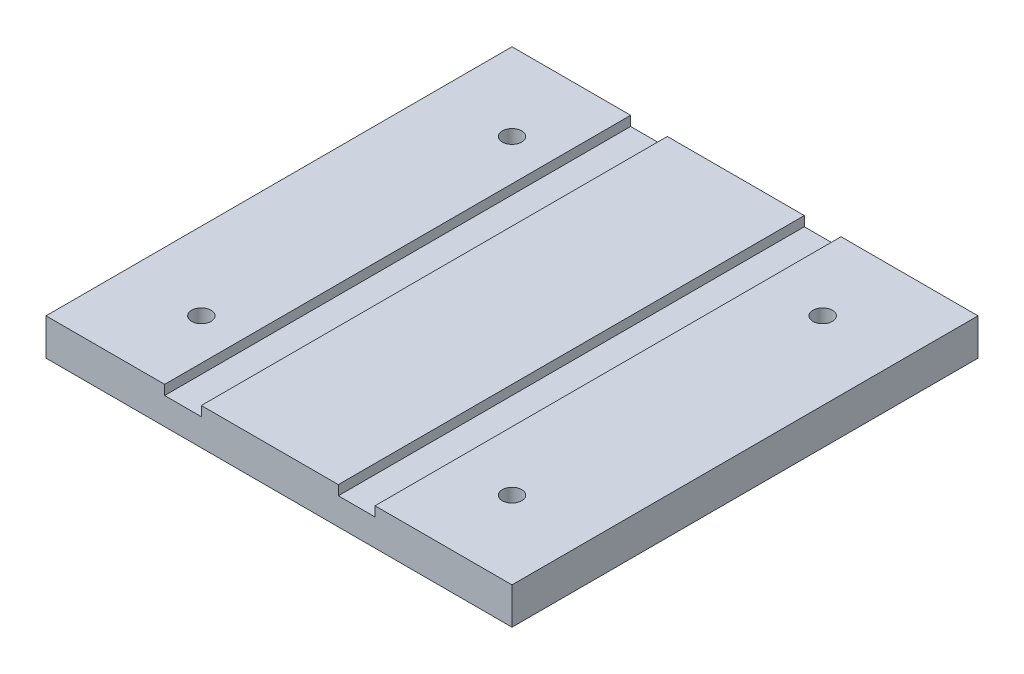
ISO-10303-21;
HEADER;
FILE_DESCRIPTION(('STEP AP214'),'2;1');
FILE_NAME('part.step','',(''),(''),'','','');
FILE_SCHEMA(('AUTOMOTIVE_DESIGN { 1 0 10303 214 1 1 1 1 }'));
ENDSEC;
DATA;
#1=APPLICATION_CONTEXT('core data for automotive mechanical design processes');
#2=APPLICATION_PROTOCOL_DEFINITION('international standard','automotive_design',2000,#1);
#3=PRODUCT_CONTEXT('',#1,'mechanical');
#4=PRODUCT('Part','Part','',(#3));
#5=PRODUCT_RELATED_PRODUCT_CATEGORY('part','',(#4));
#6=PRODUCT_DEFINITION_FORMATION('','',#4);
#7=PRODUCT_DEFINITION_CONTEXT('part definition',#1,'design');
#8=PRODUCT_DEFINITION('design','',#6,#7);
#9=PRODUCT_DEFINITION_SHAPE('','',#8);
#10=(LENGTH_UNIT() NAMED_UNIT(*) SI_UNIT(.MILLI.,.METRE.));
#11=(NAMED_UNIT(*) PLANE_ANGLE_UNIT() SI_UNIT($,.RADIAN.));
#12=(NAMED_UNIT(*) SI_UNIT($,.STERADIAN.) SOLID_ANGLE_UNIT());
#13=UNCERTAINTY_MEASURE_WITH_UNIT(LENGTH_MEASURE(1.E-05),#10,'distance_accuracy_value','');
#14=(GEOMETRIC_REPRESENTATION_CONTEXT(3) GLOBAL_UNCERTAINTY_ASSIGNED_CONTEXT((#13)) GLOBAL_UNIT_ASSIGNED_CONTEXT((#10,
#11,#12)) REPRESENTATION_CONTEXT('',''));
#15=CARTESIAN_POINT('',(0.,0.,0.));
#16=DIRECTION('',(0.,0.,1.));
#17=DIRECTION('',(1.,0.,0.));
#18=AXIS2_PLACEMENT_3D('',#15,#16,#17);
#19=CARTESIAN_POINT('',(0.,12.,0.));
#20=DIRECTION('',(0.,1.,0.));
#21=DIRECTION('',(0.,0.,1.));
#22=AXIS2_PLACEMENT_3D('',#19,#20,#21);
#23=PLANE('',#22);
#24=DIRECTION('',(0.,0.,1.));
#25=VECTOR('',#24,1.);
#26=CARTESIAN_POINT('',(19.3999993,12.,76.2));
#27=LINE('',#26,#25);
#28=CARTESIAN_POINT('',(19.3999993,12.,-76.2));
#29=VERTEX_POINT('',#28);
#30=CARTESIAN_POINT('',(19.3999993,12.,76.2));
#31=VERTEX_POINT('',#30);
#32=EDGE_CURVE('E252',#29,#31,#27,.T.);
#33=ORIENTED_EDGE('',*,*,#32,.F.);
#34=DIRECTION('',(-1.,0.,0.));
#35=VECTOR('',#34,1.);
#36=CARTESIAN_POINT('',(-76.2,12.,-76.2));
#37=LINE('',#36,#35);
#38=CARTESIAN_POINT('',(-25.4,12.,-76.2));
#39=VERTEX_POINT('',#38);
#40=EDGE_CURVE('E207',#29,#39,#37,.T.);
#41=ORIENTED_EDGE('',*,*,#40,.T.);
#42=DIRECTION('',(0.,0.,-1.));
#43=VECTOR('',#42,1.);
#44=CARTESIAN_POINT('',(-25.4,12.,76.2));
#45=LINE('',#44,#43);
#46=CARTESIAN_POINT('',(-25.4,12.,76.2));
#47=VERTEX_POINT('',#46);
#48=EDGE_CURVE('E152',#47,#39,#45,.T.);
#49=ORIENTED_EDGE('',*,*,#48,.F.);
#50=DIRECTION('',(1.,0.,0.));
#51=VECTOR('',#50,1.);
#52=CARTESIAN_POINT('',(-76.2,12.,76.2));
#53=LINE('',#52,#51);
#54=EDGE_CURVE('E213',#47,#31,#53,.T.);
#55=ORIENTED_EDGE('',*,*,#54,.T.);
#56=EDGE_LOOP('',(#33,#41,#49,#55));
#57=FACE_BOUND('',#56,.T.);
#58=ADVANCED_FACE('F33',(#57),#23,.T.);
#59=DIRECTION('',(0.,0.,1.));
#60=VECTOR('',#59,1.);
#61=CARTESIAN_POINT('',(-37.4000014,12.,76.2));
#62=LINE('',#61,#60);
#63=CARTESIAN_POINT('',(-37.4000014,12.,-76.2));
#64=VERTEX_POINT('',#63);
#65=CARTESIAN_POINT('',(-37.4000014,12.,76.2));
#66=VERTEX_POINT('',#65);
#67=EDGE_CURVE('E160',#64,#66,#62,.T.);
#68=ORIENTED_EDGE('',*,*,#67,.F.);
#69=CARTESIAN_POINT('',(-76.2,12.,-76.2));
#70=VERTEX_POINT('',#69);
#71=EDGE_CURVE('E201',#64,#70,#37,.T.);
#72=ORIENTED_EDGE('',*,*,#71,.T.);
#73=DIRECTION('',(0.,0.,1.));
#74=VECTOR('',#73,1.);
#75=CARTESIAN_POINT('',(-76.2,12.,-76.2));
#76=LINE('',#75,#74);
#77=CARTESIAN_POINT('',(-76.2,12.,76.2));
#78=VERTEX_POINT('',#77);
#79=EDGE_CURVE('E206',#70,#78,#76,.T.);
#80=ORIENTED_EDGE('',*,*,#79,.T.);
#81=EDGE_CURVE('E209',#78,#66,#53,.T.);
#82=ORIENTED_EDGE('',*,*,#81,.T.);
#83=EDGE_LOOP('',(#68,#72,#80,#82));
#84=FACE_BOUND('',#83,.T.);
#85=CARTESIAN_POINT('',(-50.8,12.,-50.8));
#86=DIRECTION('',(0.,1.,0.));
#87=DIRECTION('',(0.,0.,1.));
#88=AXIS2_PLACEMENT_3D('',#85,#86,#87);
#89=CIRCLE('',#88,3.175);
#90=CARTESIAN_POINT('',(-50.8,12.,-47.625));
#91=VERTEX_POINT('',#90);
#92=EDGE_CURVE('E192',#91,#91,#89,.T.);
#93=ORIENTED_EDGE('',*,*,#92,.F.);
#94=EDGE_LOOP('',(#93));
#95=FACE_BOUND('',#94,.T.);
#96=CARTESIAN_POINT('',(-50.8,12.,50.8));
#97=DIRECTION('',(0.,1.,0.));
#98=DIRECTION('',(0.,0.,1.));
#99=AXIS2_PLACEMENT_3D('',#96,#97,#98);
#100=CIRCLE('',#99,3.175);
#101=CARTESIAN_POINT('',(-50.8,12.,53.975));
#102=VERTEX_POINT('',#101);
#103=EDGE_CURVE('E180',#102,#102,#100,.T.);
#104=ORIENTED_EDGE('',*,*,#103,.F.);
#105=EDGE_LOOP('',(#104));
#106=FACE_BOUND('',#105,.T.);
#107=ADVANCED_FACE('F267',(#84,#95,#106),#23,.T.);
#108=DIRECTION('',(0.,0.,-1.));
#109=VECTOR('',#108,1.);
#110=CARTESIAN_POINT('',(31.4000007,12.,76.2));
#111=LINE('',#110,#109);
#112=CARTESIAN_POINT('',(31.4000007,12.,76.2));
#113=VERTEX_POINT('',#112);
#114=CARTESIAN_POINT('',(31.4000007,12.,-76.2));
#115=VERTEX_POINT('',#114);
#116=EDGE_CURVE('E246',#113,#115,#111,.T.);
#117=ORIENTED_EDGE('',*,*,#116,.F.);
#118=CARTESIAN_POINT('',(76.2,12.,76.2));
#119=VERTEX_POINT('',#118);
#120=EDGE_CURVE('E142',#113,#119,#53,.T.);
#121=ORIENTED_EDGE('',*,*,#120,.T.);
#122=DIRECTION('',(0.,0.,-1.));
#123=VECTOR('',#122,1.);
#124=CARTESIAN_POINT('',(76.2,12.,-76.2));
#125=LINE('',#124,#123);
#126=CARTESIAN_POINT('',(76.2,12.,-76.2));
#127=VERTEX_POINT('',#126);
#128=EDGE_CURVE('E198',#119,#127,#125,.T.);
#129=ORIENTED_EDGE('',*,*,#128,.T.);
#130=EDGE_CURVE('E203',#127,#115,#37,.T.);
#131=ORIENTED_EDGE('',*,*,#130,.T.);
#132=EDGE_LOOP('',(#117,#121,#129,#131));
#133=FACE_BOUND('',#132,.T.);
#134=CARTESIAN_POINT('',(50.8,12.,-50.8));
#135=DIRECTION('',(0.,1.,0.));
#136=DIRECTION('',(0.,0.,1.));
#137=AXIS2_PLACEMENT_3D('',#134,#135,#136);
#138=CIRCLE('',#137,3.175);
#139=CARTESIAN_POINT('',(50.8,12.,-47.625));
#140=VERTEX_POINT('',#139);
#141=EDGE_CURVE('E186',#140,#140,#138,.T.);
#142=ORIENTED_EDGE('',*,*,#141,.F.);
#143=EDGE_LOOP('',(#142));
#144=FACE_BOUND('',#143,.T.);
#145=CARTESIAN_POINT('',(50.8,12.,50.8));
#146=DIRECTION('',(0.,1.,0.));
#147=DIRECTION('',(0.,0.,1.));
#148=AXIS2_PLACEMENT_3D('',#145,#146,#147);
#149=CIRCLE('',#148,3.175);
#150=CARTESIAN_POINT('',(50.8,12.,53.975));
#151=VERTEX_POINT('',#150);
#152=EDGE_CURVE('E174',#151,#151,#149,.T.);
#153=ORIENTED_EDGE('',*,*,#152,.F.);
#154=EDGE_LOOP('',(#153));
#155=FACE_BOUND('',#154,.T.);
#156=ADVANCED_FACE('F244',(#133,#144,#155),#23,.T.);
#157=CARTESIAN_POINT('',(0.,0.,0.));
#158=DIRECTION('',(0.,1.,0.));
#159=DIRECTION('',(0.,0.,1.));
#160=AXIS2_PLACEMENT_3D('',#157,#158,#159);
#161=PLANE('',#160);
#162=DIRECTION('',(0.,0.,-1.));
#163=VECTOR('',#162,1.);
#164=CARTESIAN_POINT('',(76.2,0.,-76.2));
#165=LINE('',#164,#163);
#166=CARTESIAN_POINT('',(76.2,0.,76.2));
#167=VERTEX_POINT('',#166);
#168=CARTESIAN_POINT('',(76.2,0.,-76.2));
#169=VERTEX_POINT('',#168);
#170=EDGE_CURVE('E195',#167,#169,#165,.T.);
#171=ORIENTED_EDGE('',*,*,#170,.F.);
#172=DIRECTION('',(1.,0.,0.));
#173=VECTOR('',#172,1.);
#174=CARTESIAN_POINT('',(-76.2,0.,76.2));
#175=LINE('',#174,#173);
#176=CARTESIAN_POINT('',(-76.2,0.,76.2));
#177=VERTEX_POINT('',#176);
#178=EDGE_CURVE('E202',#177,#167,#175,.T.);
#179=ORIENTED_EDGE('',*,*,#178,.F.);
#180=DIRECTION('',(0.,0.,1.));
#181=VECTOR('',#180,1.);
#182=CARTESIAN_POINT('',(-76.2,0.,-76.2));
#183=LINE('',#182,#181);
#184=CARTESIAN_POINT('',(-76.2,0.,-76.2));
#185=VERTEX_POINT('',#184);
#186=EDGE_CURVE('E218',#185,#177,#183,.T.);
#187=ORIENTED_EDGE('',*,*,#186,.F.);
#188=DIRECTION('',(-1.,0.,0.));
#189=VECTOR('',#188,1.);
#190=CARTESIAN_POINT('',(-76.2,0.,-76.2));
#191=LINE('',#190,#189);
#192=EDGE_CURVE('E216',#169,#185,#191,.T.);
#193=ORIENTED_EDGE('',*,*,#192,.F.);
#194=EDGE_LOOP('',(#171,#179,#187,#193));
#195=FACE_BOUND('',#194,.T.);
#196=CARTESIAN_POINT('',(-50.8,0.,-50.8));
#197=DIRECTION('',(0.,1.,0.));
#198=DIRECTION('',(0.,0.,1.));
#199=AXIS2_PLACEMENT_3D('',#196,#197,#198);
#200=CIRCLE('',#199,3.175);
#201=CARTESIAN_POINT('',(-50.8,0.,-47.625));
#202=VERTEX_POINT('',#201);
#203=EDGE_CURVE('E189',#202,#202,#200,.T.);
#204=ORIENTED_EDGE('',*,*,#203,.T.);
#205=EDGE_LOOP('',(#204));
#206=FACE_BOUND('',#205,.T.);
#207=CARTESIAN_POINT('',(50.8,0.,-50.8));
#208=DIRECTION('',(0.,1.,0.));
#209=DIRECTION('',(0.,0.,1.));
#210=AXIS2_PLACEMENT_3D('',#207,#208,#209);
#211=CIRCLE('',#210,3.175);
#212=CARTESIAN_POINT('',(50.8,0.,-47.625));
#213=VERTEX_POINT('',#212);
#214=EDGE_CURVE('E183',#213,#213,#211,.T.);
#215=ORIENTED_EDGE('',*,*,#214,.T.);
#216=EDGE_LOOP('',(#215));
#217=FACE_BOUND('',#216,.T.);
#218=CARTESIAN_POINT('',(-50.8,0.,50.8));
#219=DIRECTION('',(0.,1.,0.));
#220=DIRECTION('',(0.,0.,1.));
#221=AXIS2_PLACEMENT_3D('',#218,#219,#220);
#222=CIRCLE('',#221,3.175);
#223=CARTESIAN_POINT('',(-50.8,0.,53.975));
#224=VERTEX_POINT('',#223);
#225=EDGE_CURVE('E177',#224,#224,#222,.T.);
#226=ORIENTED_EDGE('',*,*,#225,.T.);
#227=EDGE_LOOP('',(#226));
#228=FACE_BOUND('',#227,.T.);
#229=CARTESIAN_POINT('',(50.8,0.,50.8));
#230=DIRECTION('',(0.,1.,0.));
#231=DIRECTION('',(0.,0.,1.));
#232=AXIS2_PLACEMENT_3D('',#229,#230,#231);
#233=CIRCLE('',#232,3.175);
#234=CARTESIAN_POINT('',(50.8,0.,53.975));
#235=VERTEX_POINT('',#234);
#236=EDGE_CURVE('E166',#235,#235,#233,.T.);
#237=ORIENTED_EDGE('',*,*,#236,.T.);
#238=EDGE_LOOP('',(#237));
#239=FACE_BOUND('',#238,.T.);
#240=ADVANCED_FACE('F237',(#195,#206,#217,#228,#239),#161,.F.);
#241=CARTESIAN_POINT('',(76.2,12.,-76.2));
#242=DIRECTION('',(-1.,0.,0.));
#243=DIRECTION('',(0.,0.,1.));
#244=AXIS2_PLACEMENT_3D('',#241,#242,#243);
#245=PLANE('',#244);
#246=ORIENTED_EDGE('',*,*,#170,.T.);
#247=DIRECTION('',(0.,-1.,0.));
#248=VECTOR('',#247,1.);
#249=CARTESIAN_POINT('',(76.2,12.,-76.2));
#250=LINE('',#249,#248);
#251=EDGE_CURVE('E11',#127,#169,#250,.T.);
#252=ORIENTED_EDGE('',*,*,#251,.F.);
#253=ORIENTED_EDGE('',*,*,#128,.F.);
#254=DIRECTION('',(0.,-1.,0.));
#255=VECTOR('',#254,1.);
#256=CARTESIAN_POINT('',(76.2,12.,76.2));
#257=LINE('',#256,#255);
#258=EDGE_CURVE('E212',#119,#167,#257,.T.);
#259=ORIENTED_EDGE('',*,*,#258,.T.);
#260=EDGE_LOOP('',(#246,#252,#253,#259));
#261=FACE_BOUND('',#260,.T.);
#262=ADVANCED_FACE('F35',(#261),#245,.F.);
#263=CARTESIAN_POINT('',(-76.2,12.,-76.2));
#264=DIRECTION('',(0.,0.,1.));
#265=DIRECTION('',(1.,0.,0.));
#266=AXIS2_PLACEMENT_3D('',#263,#264,#265);
#267=PLANE('',#266);
#268=ORIENTED_EDGE('',*,*,#40,.F.);
#269=DIRECTION('',(0.,1.,0.));
#270=VECTOR('',#269,1.);
#271=CARTESIAN_POINT('',(19.3999993,8.825,-76.2));
#272=LINE('',#271,#270);
#273=CARTESIAN_POINT('',(19.3999993,8.825,-76.2));
#274=VERTEX_POINT('',#273);
#275=EDGE_CURVE('E145',#274,#29,#272,.T.);
#276=ORIENTED_EDGE('',*,*,#275,.F.);
#277=DIRECTION('',(-1.,0.,0.));
#278=VECTOR('',#277,1.);
#279=CARTESIAN_POINT('',(31.4000007,8.825,-76.2));
#280=LINE('',#279,#278);
#281=CARTESIAN_POINT('',(31.4000007,8.825,-76.2));
#282=VERTEX_POINT('',#281);
#283=EDGE_CURVE('E131',#282,#274,#280,.T.);
#284=ORIENTED_EDGE('',*,*,#283,.F.);
#285=DIRECTION('',(0.,1.,0.));
#286=VECTOR('',#285,1.);
#287=CARTESIAN_POINT('',(31.4000007,8.825,-76.2));
#288=LINE('',#287,#286);
#289=EDGE_CURVE('E129',#282,#115,#288,.T.);
#290=ORIENTED_EDGE('',*,*,#289,.T.);
#291=ORIENTED_EDGE('',*,*,#130,.F.);
#292=ORIENTED_EDGE('',*,*,#251,.T.);
#293=ORIENTED_EDGE('',*,*,#192,.T.);
#294=DIRECTION('',(0.,-1.,0.));
#295=VECTOR('',#294,1.);
#296=CARTESIAN_POINT('',(-76.2,12.,-76.2));
#297=LINE('',#296,#295);
#298=EDGE_CURVE('E41',#70,#185,#297,.T.);
#299=ORIENTED_EDGE('',*,*,#298,.F.);
#300=ORIENTED_EDGE('',*,*,#71,.F.);
#301=DIRECTION('',(0.,1.,0.));
#302=VECTOR('',#301,1.);
#303=CARTESIAN_POINT('',(-37.4000014,8.825,-76.2));
#304=LINE('',#303,#302);
#305=CARTESIAN_POINT('',(-37.4000014,8.825,-76.2));
#306=VERTEX_POINT('',#305);
#307=EDGE_CURVE('E164',#306,#64,#304,.T.);
#308=ORIENTED_EDGE('',*,*,#307,.F.);
#309=DIRECTION('',(-1.,0.,0.));
#310=VECTOR('',#309,1.);
#311=CARTESIAN_POINT('',(-25.4,8.825,-76.2));
#312=LINE('',#311,#310);
#313=CARTESIAN_POINT('',(-25.4,8.825,-76.2));
#314=VERTEX_POINT('',#313);
#315=EDGE_CURVE('E157',#314,#306,#312,.T.);
#316=ORIENTED_EDGE('',*,*,#315,.F.);
#317=DIRECTION('',(0.,1.,0.));
#318=VECTOR('',#317,1.);
#319=CARTESIAN_POINT('',(-25.4,8.825,-76.2));
#320=LINE('',#319,#318);
#321=EDGE_CURVE('E167',#314,#39,#320,.T.);
#322=ORIENTED_EDGE('',*,*,#321,.T.);
#323=EDGE_LOOP('',(#268,#276,#284,#290,#291,#292,#293,#299,#300,#308,#316,#322));
#324=FACE_BOUND('',#323,.T.);
#325=ADVANCED_FACE('F263',(#324),#267,.F.);
#326=CARTESIAN_POINT('',(-76.2,12.,-76.2));
#327=DIRECTION('',(1.,0.,0.));
#328=DIRECTION('',(0.,0.,-1.));
#329=AXIS2_PLACEMENT_3D('',#326,#327,#328);
#330=PLANE('',#329);
#331=ORIENTED_EDGE('',*,*,#186,.T.);
#332=DIRECTION('',(0.,-1.,0.));
#333=VECTOR('',#332,1.);
#334=CARTESIAN_POINT('',(-76.2,12.,76.2));
#335=LINE('',#334,#333);
#336=EDGE_CURVE('E223',#78,#177,#335,.T.);
#337=ORIENTED_EDGE('',*,*,#336,.F.);
#338=ORIENTED_EDGE('',*,*,#79,.F.);
#339=ORIENTED_EDGE('',*,*,#298,.T.);
#340=EDGE_LOOP('',(#331,#337,#338,#339));
#341=FACE_BOUND('',#340,.T.);
#342=ADVANCED_FACE('F230',(#341),#330,.F.);
#343=CARTESIAN_POINT('',(-76.2,12.,76.2));
#344=DIRECTION('',(0.,0.,-1.));
#345=DIRECTION('',(-1.,0.,0.));
#346=AXIS2_PLACEMENT_3D('',#343,#344,#345);
#347=PLANE('',#346);
#348=DIRECTION('',(1.,0.,0.));
#349=VECTOR('',#348,1.);
#350=CARTESIAN_POINT('',(31.4000007,8.825,76.2));
#351=LINE('',#350,#349);
#352=CARTESIAN_POINT('',(19.3999993,8.825,76.2));
#353=VERTEX_POINT('',#352);
#354=CARTESIAN_POINT('',(31.4000007,8.825,76.2));
#355=VERTEX_POINT('',#354);
#356=EDGE_CURVE('E132',#353,#355,#351,.T.);
#357=ORIENTED_EDGE('',*,*,#356,.F.);
#358=DIRECTION('',(0.,1.,0.));
#359=VECTOR('',#358,1.);
#360=CARTESIAN_POINT('',(19.3999993,8.825,76.2));
#361=LINE('',#360,#359);
#362=EDGE_CURVE('E143',#353,#31,#361,.T.);
#363=ORIENTED_EDGE('',*,*,#362,.T.);
#364=ORIENTED_EDGE('',*,*,#54,.F.);
#365=DIRECTION('',(0.,1.,0.));
#366=VECTOR('',#365,1.);
#367=CARTESIAN_POINT('',(-25.4,8.825,76.2));
#368=LINE('',#367,#366);
#369=CARTESIAN_POINT('',(-25.4,8.825,76.2));
#370=VERTEX_POINT('',#369);
#371=EDGE_CURVE('E170',#370,#47,#368,.T.);
#372=ORIENTED_EDGE('',*,*,#371,.F.);
#373=DIRECTION('',(1.,0.,0.));
#374=VECTOR('',#373,1.);
#375=CARTESIAN_POINT('',(-25.4,8.825,76.2));
#376=LINE('',#375,#374);
#377=CARTESIAN_POINT('',(-37.4000014,8.825,76.2));
#378=VERTEX_POINT('',#377);
#379=EDGE_CURVE('E151',#378,#370,#376,.T.);
#380=ORIENTED_EDGE('',*,*,#379,.F.);
#381=DIRECTION('',(0.,1.,0.));
#382=VECTOR('',#381,1.);
#383=CARTESIAN_POINT('',(-37.4000014,8.825,76.2));
#384=LINE('',#383,#382);
#385=EDGE_CURVE('E159',#378,#66,#384,.T.);
#386=ORIENTED_EDGE('',*,*,#385,.T.);
#387=ORIENTED_EDGE('',*,*,#81,.F.);
#388=ORIENTED_EDGE('',*,*,#336,.T.);
#389=ORIENTED_EDGE('',*,*,#178,.T.);
#390=ORIENTED_EDGE('',*,*,#258,.F.);
#391=ORIENTED_EDGE('',*,*,#120,.F.);
#392=DIRECTION('',(0.,1.,0.));
#393=VECTOR('',#392,1.);
#394=CARTESIAN_POINT('',(31.4000007,8.825,76.2));
#395=LINE('',#394,#393);
#396=EDGE_CURVE('E126',#355,#113,#395,.T.);
#397=ORIENTED_EDGE('',*,*,#396,.F.);
#398=EDGE_LOOP('',(#357,#363,#364,#372,#380,#386,#387,#388,#389,#390,#391,#397));
#399=FACE_BOUND('',#398,.T.);
#400=ADVANCED_FACE('F140',(#399),#347,.F.);
#401=CARTESIAN_POINT('',(-50.8,12.,-50.8));
#402=DIRECTION('',(0.,-1.,0.));
#403=DIRECTION('',(0.,0.,-1.));
#404=AXIS2_PLACEMENT_3D('',#401,#402,#403);
#405=CYLINDRICAL_SURFACE('',#404,3.175);
#406=ORIENTED_EDGE('',*,*,#92,.T.);
#407=EDGE_LOOP('',(#406));
#408=FACE_BOUND('',#407,.T.);
#409=ORIENTED_EDGE('',*,*,#203,.F.);
#410=EDGE_LOOP('',(#409));
#411=FACE_BOUND('',#410,.T.);
#412=ADVANCED_FACE('F301',(#408,#411),#405,.F.);
#413=CARTESIAN_POINT('',(50.8,12.,-50.8));
#414=DIRECTION('',(0.,-1.,0.));
#415=DIRECTION('',(0.,0.,-1.));
#416=AXIS2_PLACEMENT_3D('',#413,#414,#415);
#417=CYLINDRICAL_SURFACE('',#416,3.175);
#418=ORIENTED_EDGE('',*,*,#141,.T.);
#419=EDGE_LOOP('',(#418));
#420=FACE_BOUND('',#419,.T.);
#421=ORIENTED_EDGE('',*,*,#214,.F.);
#422=EDGE_LOOP('',(#421));
#423=FACE_BOUND('',#422,.T.);
#424=ADVANCED_FACE('F323',(#420,#423),#417,.F.);
#425=CARTESIAN_POINT('',(-50.8,12.,50.8));
#426=DIRECTION('',(0.,-1.,0.));
#427=DIRECTION('',(0.,0.,-1.));
#428=AXIS2_PLACEMENT_3D('',#425,#426,#427);
#429=CYLINDRICAL_SURFACE('',#428,3.175);
#430=ORIENTED_EDGE('',*,*,#103,.T.);
#431=EDGE_LOOP('',(#430));
#432=FACE_BOUND('',#431,.T.);
#433=ORIENTED_EDGE('',*,*,#225,.F.);
#434=EDGE_LOOP('',(#433));
#435=FACE_BOUND('',#434,.T.);
#436=ADVANCED_FACE('F330',(#432,#435),#429,.F.);
#437=CARTESIAN_POINT('',(50.8,12.,50.8));
#438=DIRECTION('',(0.,-1.,0.));
#439=DIRECTION('',(0.,0.,-1.));
#440=AXIS2_PLACEMENT_3D('',#437,#438,#439);
#441=CYLINDRICAL_SURFACE('',#440,3.175);
#442=ORIENTED_EDGE('',*,*,#152,.T.);
#443=EDGE_LOOP('',(#442));
#444=FACE_BOUND('',#443,.T.);
#445=ORIENTED_EDGE('',*,*,#236,.F.);
#446=EDGE_LOOP('',(#445));
#447=FACE_BOUND('',#446,.T.);
#448=ADVANCED_FACE('F282',(#444,#447),#441,.F.);
#449=CARTESIAN_POINT('',(-37.4000014,8.825,76.2));
#450=DIRECTION('',(-1.,0.,0.));
#451=DIRECTION('',(0.,0.,1.));
#452=AXIS2_PLACEMENT_3D('',#449,#450,#451);
#453=PLANE('',#452);
#454=ORIENTED_EDGE('',*,*,#67,.T.);
#455=ORIENTED_EDGE('',*,*,#385,.F.);
#456=DIRECTION('',(0.,0.,1.));
#457=VECTOR('',#456,1.);
#458=CARTESIAN_POINT('',(-37.4000014,8.825,76.2));
#459=LINE('',#458,#457);
#460=EDGE_CURVE('E56',#306,#378,#459,.T.);
#461=ORIENTED_EDGE('',*,*,#460,.F.);
#462=ORIENTED_EDGE('',*,*,#307,.T.);
#463=EDGE_LOOP('',(#454,#455,#461,#462));
#464=FACE_BOUND('',#463,.T.);
#465=ADVANCED_FACE('F271',(#464),#453,.F.);
#466=CARTESIAN_POINT('',(-25.4,8.825,76.2));
#467=DIRECTION('',(1.,0.,0.));
#468=DIRECTION('',(0.,0.,-1.));
#469=AXIS2_PLACEMENT_3D('',#466,#467,#468);
#470=PLANE('',#469);
#471=ORIENTED_EDGE('',*,*,#48,.T.);
#472=ORIENTED_EDGE('',*,*,#321,.F.);
#473=DIRECTION('',(0.,0.,-1.));
#474=VECTOR('',#473,1.);
#475=CARTESIAN_POINT('',(-25.4,8.825,76.2));
#476=LINE('',#475,#474);
#477=EDGE_CURVE('E154',#370,#314,#476,.T.);
#478=ORIENTED_EDGE('',*,*,#477,.F.);
#479=ORIENTED_EDGE('',*,*,#371,.T.);
#480=EDGE_LOOP('',(#471,#472,#478,#479));
#481=FACE_BOUND('',#480,.T.);
#482=ADVANCED_FACE('F274',(#481),#470,.F.);
#483=CARTESIAN_POINT('',(0.,8.825,0.));
#484=DIRECTION('',(0.,1.,0.));
#485=DIRECTION('',(0.,0.,1.));
#486=AXIS2_PLACEMENT_3D('',#483,#484,#485);
#487=PLANE('',#486);
#488=ORIENTED_EDGE('',*,*,#460,.T.);
#489=ORIENTED_EDGE('',*,*,#379,.T.);
#490=ORIENTED_EDGE('',*,*,#477,.T.);
#491=ORIENTED_EDGE('',*,*,#315,.T.);
#492=EDGE_LOOP('',(#488,#489,#490,#491));
#493=FACE_BOUND('',#492,.T.);
#494=ADVANCED_FACE('F272',(#493),#487,.T.);
#495=CARTESIAN_POINT('',(19.3999993,8.825,76.2));
#496=DIRECTION('',(-1.,0.,0.));
#497=DIRECTION('',(0.,0.,1.));
#498=AXIS2_PLACEMENT_3D('',#495,#496,#497);
#499=PLANE('',#498);
#500=ORIENTED_EDGE('',*,*,#32,.T.);
#501=ORIENTED_EDGE('',*,*,#362,.F.);
#502=DIRECTION('',(0.,0.,1.));
#503=VECTOR('',#502,1.);
#504=CARTESIAN_POINT('',(19.3999993,8.825,76.2));
#505=LINE('',#504,#503);
#506=EDGE_CURVE('E48',#274,#353,#505,.T.);
#507=ORIENTED_EDGE('',*,*,#506,.F.);
#508=ORIENTED_EDGE('',*,*,#275,.T.);
#509=EDGE_LOOP('',(#500,#501,#507,#508));
#510=FACE_BOUND('',#509,.T.);
#511=ADVANCED_FACE('F257',(#510),#499,.F.);
#512=CARTESIAN_POINT('',(31.4000007,8.825,76.2));
#513=DIRECTION('',(1.,0.,0.));
#514=DIRECTION('',(0.,0.,-1.));
#515=AXIS2_PLACEMENT_3D('',#512,#513,#514);
#516=PLANE('',#515);
#517=ORIENTED_EDGE('',*,*,#116,.T.);
#518=ORIENTED_EDGE('',*,*,#289,.F.);
#519=DIRECTION('',(0.,0.,-1.));
#520=VECTOR('',#519,1.);
#521=CARTESIAN_POINT('',(31.4000007,8.825,76.2));
#522=LINE('',#521,#520);
#523=EDGE_CURVE('E123',#355,#282,#522,.T.);
#524=ORIENTED_EDGE('',*,*,#523,.F.);
#525=ORIENTED_EDGE('',*,*,#396,.T.);
#526=EDGE_LOOP('',(#517,#518,#524,#525));
#527=FACE_BOUND('',#526,.T.);
#528=ADVANCED_FACE('F124',(#527),#516,.F.);
#529=CARTESIAN_POINT('',(0.,8.825,0.));
#530=DIRECTION('',(0.,1.,0.));
#531=DIRECTION('',(0.,0.,1.));
#532=AXIS2_PLACEMENT_3D('',#529,#530,#531);
#533=PLANE('',#532);
#534=ORIENTED_EDGE('',*,*,#506,.T.);
#535=ORIENTED_EDGE('',*,*,#356,.T.);
#536=ORIENTED_EDGE('',*,*,#523,.T.);
#537=ORIENTED_EDGE('',*,*,#283,.T.);
#538=EDGE_LOOP('',(#534,#535,#536,#537));
#539=FACE_BOUND('',#538,.T.);
#540=ADVANCED_FACE('F135',(#539),#533,.T.);
#541=CLOSED_SHELL('',(#58,#107,#156,#240,#262,#325,#342,#400,#412,#424,#436,#448,#465,#482,#494,
#511,#528,#540));
#542=MANIFOLD_SOLID_BREP('B2',#541);
#543=ADVANCED_BREP_SHAPE_REPRESENTATION('',(#18,#542),#14);
#544=SHAPE_DEFINITION_REPRESENTATION(#9,#543);
ENDSEC;
END-ISO-10303-21;
